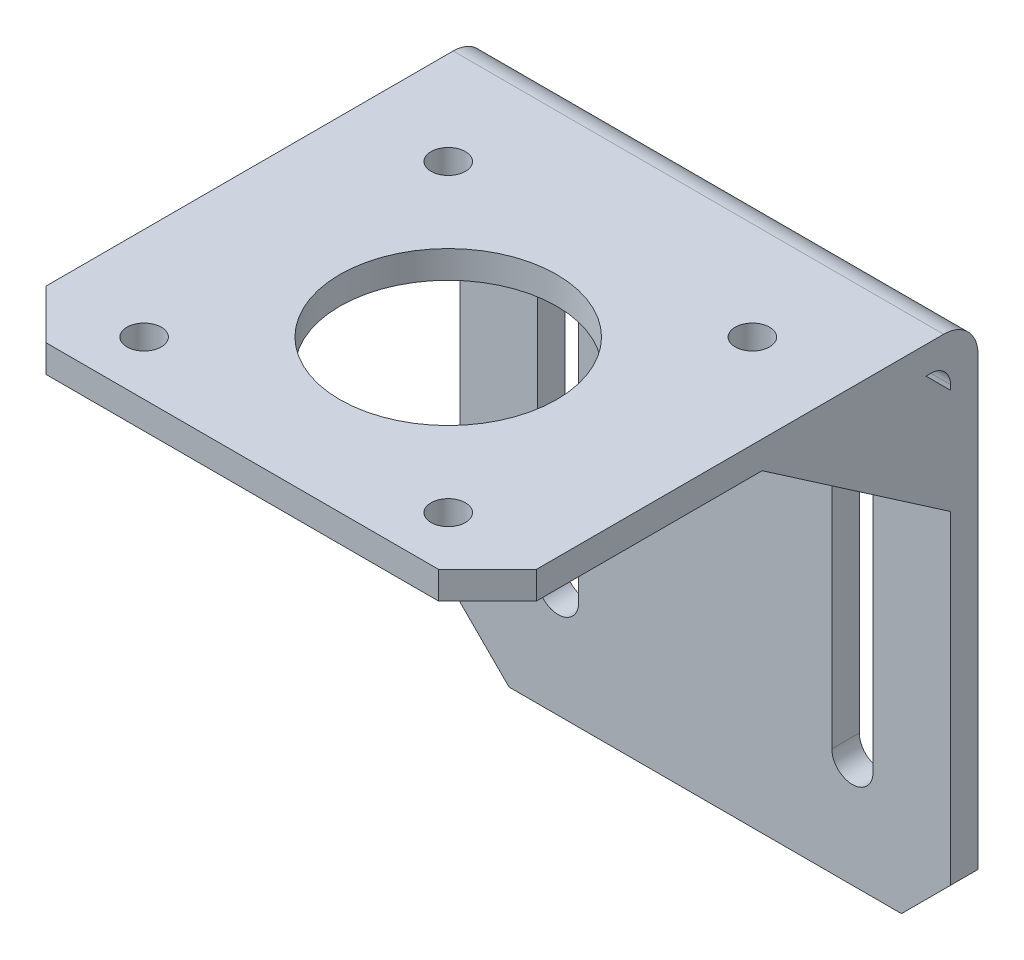
ISO-10303-21;
HEADER;
FILE_DESCRIPTION(('STEP AP214'),'2;1');
FILE_NAME('part.step','',(''),(''),'','','');
FILE_SCHEMA(('AUTOMOTIVE_DESIGN { 1 0 10303 214 1 1 1 1 }'));
ENDSEC;
DATA;
#1=APPLICATION_CONTEXT('core data for automotive mechanical design processes');
#2=APPLICATION_PROTOCOL_DEFINITION('international standard','automotive_design',2000,#1);
#3=PRODUCT_CONTEXT('',#1,'mechanical');
#4=PRODUCT('Part','Part','',(#3));
#5=PRODUCT_RELATED_PRODUCT_CATEGORY('part','',(#4));
#6=PRODUCT_DEFINITION_FORMATION('','',#4);
#7=PRODUCT_DEFINITION_CONTEXT('part definition',#1,'design');
#8=PRODUCT_DEFINITION('design','',#6,#7);
#9=PRODUCT_DEFINITION_SHAPE('','',#8);
#10=(LENGTH_UNIT() NAMED_UNIT(*) SI_UNIT(.MILLI.,.METRE.));
#11=(NAMED_UNIT(*) PLANE_ANGLE_UNIT() SI_UNIT($,.RADIAN.));
#12=(NAMED_UNIT(*) SI_UNIT($,.STERADIAN.) SOLID_ANGLE_UNIT());
#13=UNCERTAINTY_MEASURE_WITH_UNIT(LENGTH_MEASURE(1.E-05),#10,'distance_accuracy_value','');
#14=(GEOMETRIC_REPRESENTATION_CONTEXT(3) GLOBAL_UNCERTAINTY_ASSIGNED_CONTEXT((#13)) GLOBAL_UNIT_ASSIGNED_CONTEXT((#10,
#11,#12)) REPRESENTATION_CONTEXT('',''));
#15=CARTESIAN_POINT('',(0.,0.,0.));
#16=DIRECTION('',(0.,0.,1.));
#17=DIRECTION('',(1.,0.,0.));
#18=AXIS2_PLACEMENT_3D('',#15,#16,#17);
#19=CARTESIAN_POINT('',(-25.,-2.80000000000001,2.8));
#20=DIRECTION('',(0.,0.,1.));
#21=DIRECTION('',(0.,-1.,0.));
#22=AXIS2_PLACEMENT_3D('',#19,#20,#21);
#23=PLANE('',#22);
#24=CARTESIAN_POINT('',(15.,-43.,2.8));
#25=DIRECTION('',(0.,0.,1.));
#26=DIRECTION('',(0.,-1.,0.));
#27=AXIS2_PLACEMENT_3D('',#24,#25,#26);
#28=CIRCLE('',#27,2.1);
#29=CARTESIAN_POINT('',(12.9,-43.,2.8));
#30=VERTEX_POINT('',#29);
#31=CARTESIAN_POINT('',(17.1,-43.,2.8));
#32=VERTEX_POINT('',#31);
#33=EDGE_CURVE('E469',#30,#32,#28,.T.);
#34=ORIENTED_EDGE('',*,*,#33,.F.);
#35=DIRECTION('',(0.,-1.,0.));
#36=VECTOR('',#35,1.);
#37=CARTESIAN_POINT('',(12.9,-2.80000000000001,2.8));
#38=LINE('',#37,#36);
#39=CARTESIAN_POINT('',(12.9,-13.,2.8));
#40=VERTEX_POINT('',#39);
#41=EDGE_CURVE('E459',#40,#30,#38,.T.);
#42=ORIENTED_EDGE('',*,*,#41,.F.);
#43=CARTESIAN_POINT('',(15.,-13.,2.8));
#44=DIRECTION('',(0.,0.,1.));
#45=DIRECTION('',(0.,-1.,0.));
#46=AXIS2_PLACEMENT_3D('',#43,#44,#45);
#47=CIRCLE('',#46,2.1);
#48=CARTESIAN_POINT('',(17.1,-13.,2.8));
#49=VERTEX_POINT('',#48);
#50=EDGE_CURVE('E462',#49,#40,#47,.T.);
#51=ORIENTED_EDGE('',*,*,#50,.F.);
#52=DIRECTION('',(0.,1.,0.));
#53=VECTOR('',#52,1.);
#54=CARTESIAN_POINT('',(17.1,-2.80000000000002,2.8));
#55=LINE('',#54,#53);
#56=EDGE_CURVE('E466',#32,#49,#55,.T.);
#57=ORIENTED_EDGE('',*,*,#56,.F.);
#58=EDGE_LOOP('',(#34,#42,#51,#57));
#59=FACE_BOUND('',#58,.T.);
#60=CARTESIAN_POINT('',(-15.,-43.,2.8));
#61=DIRECTION('',(0.,0.,1.));
#62=DIRECTION('',(0.,-1.,0.));
#63=AXIS2_PLACEMENT_3D('',#60,#61,#62);
#64=CIRCLE('',#63,2.1);
#65=CARTESIAN_POINT('',(-17.1,-43.,2.8));
#66=VERTEX_POINT('',#65);
#67=CARTESIAN_POINT('',(-12.9,-43.,2.8));
#68=VERTEX_POINT('',#67);
#69=EDGE_CURVE('E456',#66,#68,#64,.T.);
#70=ORIENTED_EDGE('',*,*,#69,.F.);
#71=DIRECTION('',(0.,-1.,0.));
#72=VECTOR('',#71,1.);
#73=CARTESIAN_POINT('',(-17.1,-2.80000000000001,2.8));
#74=LINE('',#73,#72);
#75=CARTESIAN_POINT('',(-17.1,-13.,2.8));
#76=VERTEX_POINT('',#75);
#77=EDGE_CURVE('E417',#76,#66,#74,.T.);
#78=ORIENTED_EDGE('',*,*,#77,.F.);
#79=CARTESIAN_POINT('',(-15.,-13.,2.8));
#80=DIRECTION('',(0.,0.,1.));
#81=DIRECTION('',(0.,-1.,0.));
#82=AXIS2_PLACEMENT_3D('',#79,#80,#81);
#83=CIRCLE('',#82,2.1);
#84=CARTESIAN_POINT('',(-12.9,-13.,2.8));
#85=VERTEX_POINT('',#84);
#86=EDGE_CURVE('E449',#85,#76,#83,.T.);
#87=ORIENTED_EDGE('',*,*,#86,.F.);
#88=DIRECTION('',(0.,1.,0.));
#89=VECTOR('',#88,1.);
#90=CARTESIAN_POINT('',(-12.9,-2.80000000000001,2.8));
#91=LINE('',#90,#89);
#92=EDGE_CURVE('E453',#68,#85,#91,.T.);
#93=ORIENTED_EDGE('',*,*,#92,.F.);
#94=EDGE_LOOP('',(#70,#78,#87,#93));
#95=FACE_BOUND('',#94,.T.);
#96=DIRECTION('',(0.,-1.,0.));
#97=VECTOR('',#96,1.);
#98=CARTESIAN_POINT('',(25.,-2.80000000000001,2.8));
#99=LINE('',#98,#97);
#100=CARTESIAN_POINT('',(25.,-16.,2.8));
#101=VERTEX_POINT('',#100);
#102=CARTESIAN_POINT('',(25.,-49.,2.79999999999999));
#103=VERTEX_POINT('',#102);
#104=EDGE_CURVE('E389',#101,#103,#99,.T.);
#105=ORIENTED_EDGE('',*,*,#104,.F.);
#106=DIRECTION('',(1.,0.,0.));
#107=VECTOR('',#106,1.);
#108=CARTESIAN_POINT('',(22.5,-16.,2.8));
#109=LINE('',#108,#107);
#110=CARTESIAN_POINT('',(22.5,-16.,2.8));
#111=VERTEX_POINT('',#110);
#112=EDGE_CURVE('E55',#111,#101,#109,.T.);
#113=ORIENTED_EDGE('',*,*,#112,.F.);
#114=DIRECTION('',(0.,-1.,0.));
#115=VECTOR('',#114,1.);
#116=CARTESIAN_POINT('',(22.5,-16.,2.8));
#117=LINE('',#116,#115);
#118=CARTESIAN_POINT('',(22.5,-5.30000000000003,2.8));
#119=VERTEX_POINT('',#118);
#120=EDGE_CURVE('E228',#119,#111,#117,.T.);
#121=ORIENTED_EDGE('',*,*,#120,.F.);
#122=DIRECTION('',(1.,0.,0.));
#123=VECTOR('',#122,1.);
#124=CARTESIAN_POINT('',(22.5,-5.30000000000003,2.8));
#125=LINE('',#124,#123);
#126=CARTESIAN_POINT('',(25.,-5.30000000000003,2.8));
#127=VERTEX_POINT('',#126);
#128=EDGE_CURVE('E236',#119,#127,#125,.T.);
#129=ORIENTED_EDGE('',*,*,#128,.T.);
#130=CARTESIAN_POINT('',(25.,-4.80000000000001,2.8));
#131=VERTEX_POINT('',#130);
#132=EDGE_CURVE('E390',#131,#127,#99,.T.);
#133=ORIENTED_EDGE('',*,*,#132,.F.);
#134=DIRECTION('',(1.,0.,0.));
#135=VECTOR('',#134,1.);
#136=CARTESIAN_POINT('',(-25.,-4.80000000000001,2.8));
#137=LINE('',#136,#135);
#138=CARTESIAN_POINT('',(-25.,-4.80000000000001,2.8));
#139=VERTEX_POINT('',#138);
#140=EDGE_CURVE('E532',#131,#139,#137,.F.);
#141=ORIENTED_EDGE('',*,*,#140,.T.);
#142=DIRECTION('',(0.,-1.,0.));
#143=VECTOR('',#142,1.);
#144=CARTESIAN_POINT('',(-25.,-2.80000000000001,2.8));
#145=LINE('',#144,#143);
#146=CARTESIAN_POINT('',(-25.,-5.30000000000003,2.8));
#147=VERTEX_POINT('',#146);
#148=EDGE_CURVE('E405',#139,#147,#145,.T.);
#149=ORIENTED_EDGE('',*,*,#148,.T.);
#150=DIRECTION('',(-1.,0.,0.));
#151=VECTOR('',#150,1.);
#152=CARTESIAN_POINT('',(-22.5,-5.30000000000003,2.8));
#153=LINE('',#152,#151);
#154=CARTESIAN_POINT('',(-22.5,-5.30000000000003,2.8));
#155=VERTEX_POINT('',#154);
#156=EDGE_CURVE('E288',#155,#147,#153,.T.);
#157=ORIENTED_EDGE('',*,*,#156,.F.);
#158=DIRECTION('',(0.,-1.,0.));
#159=VECTOR('',#158,1.);
#160=CARTESIAN_POINT('',(-22.5,-16.,2.8));
#161=LINE('',#160,#159);
#162=CARTESIAN_POINT('',(-22.5,-16.,2.8));
#163=VERTEX_POINT('',#162);
#164=EDGE_CURVE('E266',#155,#163,#161,.T.);
#165=ORIENTED_EDGE('',*,*,#164,.T.);
#166=DIRECTION('',(-1.,0.,0.));
#167=VECTOR('',#166,1.);
#168=CARTESIAN_POINT('',(-22.5,-16.,2.8));
#169=LINE('',#168,#167);
#170=CARTESIAN_POINT('',(-25.,-16.,2.8));
#171=VERTEX_POINT('',#170);
#172=EDGE_CURVE('E281',#163,#171,#169,.T.);
#173=ORIENTED_EDGE('',*,*,#172,.T.);
#174=CARTESIAN_POINT('',(-25.,-49.,2.79999999999999));
#175=VERTEX_POINT('',#174);
#176=EDGE_CURVE('E404',#171,#175,#145,.T.);
#177=ORIENTED_EDGE('',*,*,#176,.T.);
#178=DIRECTION('',(0.707106781186546,-0.707106781186548,0.));
#179=VECTOR('',#178,1.);
#180=CARTESIAN_POINT('',(-48.1,-25.8999999999999,2.8));
#181=LINE('',#180,#179);
#182=CARTESIAN_POINT('',(-20.,-54.,2.79999999999999));
#183=VERTEX_POINT('',#182);
#184=EDGE_CURVE('E493',#175,#183,#181,.T.);
#185=ORIENTED_EDGE('',*,*,#184,.T.);
#186=DIRECTION('',(1.,0.,0.));
#187=VECTOR('',#186,1.);
#188=CARTESIAN_POINT('',(-25.,-54.,2.79999999999999));
#189=LINE('',#188,#187);
#190=CARTESIAN_POINT('',(20.,-54.,2.79999999999999));
#191=VERTEX_POINT('',#190);
#192=EDGE_CURVE('E418',#183,#191,#189,.T.);
#193=ORIENTED_EDGE('',*,*,#192,.T.);
#194=DIRECTION('',(-0.707106781186549,-0.707106781186547,0.));
#195=VECTOR('',#194,1.);
#196=CARTESIAN_POINT('',(23.0999999999999,-50.9000000000001,2.79999999999999));
#197=LINE('',#196,#195);
#198=EDGE_CURVE('E496',#191,#103,#197,.F.);
#199=ORIENTED_EDGE('',*,*,#198,.T.);
#200=EDGE_LOOP('',(#105,#113,#121,#129,#133,#141,#149,#157,#165,#173,#177,#185,#193,#199));
#201=FACE_BOUND('',#200,.T.);
#202=ADVANCED_FACE('F39',(#59,#95,#201),#23,.T.);
#203=CARTESIAN_POINT('',(-25.,-2.80000000000001,50.));
#204=DIRECTION('',(0.,-1.,0.));
#205=DIRECTION('',(0.,0.,-1.));
#206=AXIS2_PLACEMENT_3D('',#203,#204,#205);
#207=PLANE('',#206);
#208=CARTESIAN_POINT('',(-15.5,-2.8,44.5));
#209=DIRECTION('',(0.,-1.,0.));
#210=DIRECTION('',(0.,0.,-1.));
#211=AXIS2_PLACEMENT_3D('',#208,#209,#210);
#212=CIRCLE('',#211,1.75);
#213=CARTESIAN_POINT('',(-15.5,-2.8,42.75));
#214=VERTEX_POINT('',#213);
#215=EDGE_CURVE('E384',#214,#214,#212,.T.);
#216=ORIENTED_EDGE('',*,*,#215,.F.);
#217=EDGE_LOOP('',(#216));
#218=FACE_BOUND('',#217,.T.);
#219=CARTESIAN_POINT('',(15.5,-2.8,44.5));
#220=DIRECTION('',(0.,-1.,0.));
#221=DIRECTION('',(0.,0.,-1.));
#222=AXIS2_PLACEMENT_3D('',#219,#220,#221);
#223=CIRCLE('',#222,1.75);
#224=CARTESIAN_POINT('',(15.5,-2.8,42.75));
#225=VERTEX_POINT('',#224);
#226=EDGE_CURVE('E440',#225,#225,#223,.T.);
#227=ORIENTED_EDGE('',*,*,#226,.F.);
#228=EDGE_LOOP('',(#227));
#229=FACE_BOUND('',#228,.T.);
#230=CARTESIAN_POINT('',(15.5,-2.8,13.5));
#231=DIRECTION('',(0.,-1.,0.));
#232=DIRECTION('',(0.,0.,-1.));
#233=AXIS2_PLACEMENT_3D('',#230,#231,#232);
#234=CIRCLE('',#233,1.75);
#235=CARTESIAN_POINT('',(15.5,-2.8,11.75));
#236=VERTEX_POINT('',#235);
#237=EDGE_CURVE('E436',#236,#236,#234,.T.);
#238=ORIENTED_EDGE('',*,*,#237,.F.);
#239=EDGE_LOOP('',(#238));
#240=FACE_BOUND('',#239,.T.);
#241=CARTESIAN_POINT('',(-15.5,-2.8,13.5));
#242=DIRECTION('',(0.,-1.,0.));
#243=DIRECTION('',(0.,0.,-1.));
#244=AXIS2_PLACEMENT_3D('',#241,#242,#243);
#245=CIRCLE('',#244,1.75);
#246=CARTESIAN_POINT('',(-15.5,-2.8,11.75));
#247=VERTEX_POINT('',#246);
#248=EDGE_CURVE('E432',#247,#247,#245,.T.);
#249=ORIENTED_EDGE('',*,*,#248,.F.);
#250=EDGE_LOOP('',(#249));
#251=FACE_BOUND('',#250,.T.);
#252=CARTESIAN_POINT('',(0.,-2.8,29.));
#253=DIRECTION('',(0.,-1.,0.));
#254=DIRECTION('',(0.,0.,-1.));
#255=AXIS2_PLACEMENT_3D('',#252,#253,#254);
#256=CIRCLE('',#255,11.05);
#257=CARTESIAN_POINT('',(0.,-2.8,17.95));
#258=VERTEX_POINT('',#257);
#259=EDGE_CURVE('E379',#258,#258,#256,.T.);
#260=ORIENTED_EDGE('',*,*,#259,.F.);
#261=EDGE_LOOP('',(#260));
#262=FACE_BOUND('',#261,.T.);
#263=DIRECTION('',(0.,0.,-1.));
#264=VECTOR('',#263,1.);
#265=CARTESIAN_POINT('',(22.5,-2.80000000000001,5.3));
#266=LINE('',#265,#264);
#267=CARTESIAN_POINT('',(22.5,-2.8,22.));
#268=VERTEX_POINT('',#267);
#269=CARTESIAN_POINT('',(22.5,-2.80000000000001,5.3));
#270=VERTEX_POINT('',#269);
#271=EDGE_CURVE('E230',#268,#270,#266,.T.);
#272=ORIENTED_EDGE('',*,*,#271,.F.);
#273=DIRECTION('',(1.,0.,0.));
#274=VECTOR('',#273,1.);
#275=CARTESIAN_POINT('',(22.5,-2.8,22.));
#276=LINE('',#275,#274);
#277=CARTESIAN_POINT('',(25.,-2.8,22.));
#278=VERTEX_POINT('',#277);
#279=EDGE_CURVE('E260',#268,#278,#276,.T.);
#280=ORIENTED_EDGE('',*,*,#279,.T.);
#281=DIRECTION('',(0.,0.,-1.));
#282=VECTOR('',#281,1.);
#283=CARTESIAN_POINT('',(25.,-2.80000000000001,50.));
#284=LINE('',#283,#282);
#285=CARTESIAN_POINT('',(25.,-2.80000000000001,45.));
#286=VERTEX_POINT('',#285);
#287=EDGE_CURVE('E385',#286,#278,#284,.T.);
#288=ORIENTED_EDGE('',*,*,#287,.F.);
#289=DIRECTION('',(0.707106781186549,0.,-0.707106781186547));
#290=VECTOR('',#289,1.);
#291=CARTESIAN_POINT('',(-2.50000000000008,-2.80000000000001,72.5));
#292=LINE('',#291,#290);
#293=CARTESIAN_POINT('',(20.,-2.80000000000001,50.));
#294=VERTEX_POINT('',#293);
#295=EDGE_CURVE('E515',#286,#294,#292,.F.);
#296=ORIENTED_EDGE('',*,*,#295,.T.);
#297=DIRECTION('',(1.,0.,0.));
#298=VECTOR('',#297,1.);
#299=CARTESIAN_POINT('',(-25.,-2.80000000000001,50.));
#300=LINE('',#299,#298);
#301=CARTESIAN_POINT('',(-20.,-2.80000000000001,50.));
#302=VERTEX_POINT('',#301);
#303=EDGE_CURVE('E422',#302,#294,#300,.T.);
#304=ORIENTED_EDGE('',*,*,#303,.F.);
#305=DIRECTION('',(-0.707106781186547,0.,-0.707106781186549));
#306=VECTOR('',#305,1.);
#307=CARTESIAN_POINT('',(-22.5,-2.80000000000001,47.5));
#308=LINE('',#307,#306);
#309=CARTESIAN_POINT('',(-25.,-2.80000000000001,45.));
#310=VERTEX_POINT('',#309);
#311=EDGE_CURVE('E518',#302,#310,#308,.T.);
#312=ORIENTED_EDGE('',*,*,#311,.T.);
#313=DIRECTION('',(0.,0.,-1.));
#314=VECTOR('',#313,1.);
#315=CARTESIAN_POINT('',(-25.,-2.80000000000001,50.));
#316=LINE('',#315,#314);
#317=CARTESIAN_POINT('',(-25.,-2.8,22.));
#318=VERTEX_POINT('',#317);
#319=EDGE_CURVE('E401',#310,#318,#316,.T.);
#320=ORIENTED_EDGE('',*,*,#319,.T.);
#321=DIRECTION('',(-1.,0.,0.));
#322=VECTOR('',#321,1.);
#323=CARTESIAN_POINT('',(-22.5,-2.8,22.));
#324=LINE('',#323,#322);
#325=CARTESIAN_POINT('',(-22.5,-2.80000000000001,22.));
#326=VERTEX_POINT('',#325);
#327=EDGE_CURVE('E297',#326,#318,#324,.T.);
#328=ORIENTED_EDGE('',*,*,#327,.F.);
#329=DIRECTION('',(0.,0.,-1.));
#330=VECTOR('',#329,1.);
#331=CARTESIAN_POINT('',(-22.5,-2.80000000000001,5.3));
#332=LINE('',#331,#330);
#333=CARTESIAN_POINT('',(-22.5,-2.80000000000001,5.3));
#334=VERTEX_POINT('',#333);
#335=EDGE_CURVE('E274',#326,#334,#332,.T.);
#336=ORIENTED_EDGE('',*,*,#335,.T.);
#337=DIRECTION('',(-1.,0.,0.));
#338=VECTOR('',#337,1.);
#339=CARTESIAN_POINT('',(-22.5,-2.80000000000001,5.3));
#340=LINE('',#339,#338);
#341=CARTESIAN_POINT('',(-25.,-2.80000000000001,5.3));
#342=VERTEX_POINT('',#341);
#343=EDGE_CURVE('E293',#334,#342,#340,.T.);
#344=ORIENTED_EDGE('',*,*,#343,.T.);
#345=CARTESIAN_POINT('',(-25.,-2.80000000000001,4.8));
#346=VERTEX_POINT('',#345);
#347=EDGE_CURVE('E400',#342,#346,#316,.T.);
#348=ORIENTED_EDGE('',*,*,#347,.T.);
#349=DIRECTION('',(1.,0.,0.));
#350=VECTOR('',#349,1.);
#351=CARTESIAN_POINT('',(25.,-2.80000000000001,4.8));
#352=LINE('',#351,#350);
#353=CARTESIAN_POINT('',(25.,-2.80000000000001,4.8));
#354=VERTEX_POINT('',#353);
#355=EDGE_CURVE('E528',#346,#354,#352,.T.);
#356=ORIENTED_EDGE('',*,*,#355,.T.);
#357=CARTESIAN_POINT('',(25.,-2.80000000000001,5.3));
#358=VERTEX_POINT('',#357);
#359=EDGE_CURVE('E383',#358,#354,#284,.T.);
#360=ORIENTED_EDGE('',*,*,#359,.F.);
#361=DIRECTION('',(1.,0.,0.));
#362=VECTOR('',#361,1.);
#363=CARTESIAN_POINT('',(22.5,-2.80000000000001,5.3));
#364=LINE('',#363,#362);
#365=EDGE_CURVE('E241',#270,#358,#364,.T.);
#366=ORIENTED_EDGE('',*,*,#365,.F.);
#367=EDGE_LOOP('',(#272,#280,#288,#296,#304,#312,#320,#328,#336,#344,#348,#356,#360,#366));
#368=FACE_BOUND('',#367,.T.);
#369=ADVANCED_FACE('F592',(#218,#229,#240,#251,#262,#368),#207,.T.);
#370=CARTESIAN_POINT('',(-25.,0.,0.));
#371=DIRECTION('',(0.,1.,0.));
#372=DIRECTION('',(0.,0.,1.));
#373=AXIS2_PLACEMENT_3D('',#370,#371,#372);
#374=PLANE('',#373);
#375=CARTESIAN_POINT('',(-15.5,0.,44.5));
#376=DIRECTION('',(0.,1.,0.));
#377=DIRECTION('',(0.,0.,1.));
#378=AXIS2_PLACEMENT_3D('',#375,#376,#377);
#379=CIRCLE('',#378,1.75);
#380=CARTESIAN_POINT('',(-15.5,0.,46.25));
#381=VERTEX_POINT('',#380);
#382=EDGE_CURVE('E324',#381,#381,#379,.T.);
#383=ORIENTED_EDGE('',*,*,#382,.F.);
#384=EDGE_LOOP('',(#383));
#385=FACE_BOUND('',#384,.T.);
#386=CARTESIAN_POINT('',(15.5,0.,44.5));
#387=DIRECTION('',(0.,1.,0.));
#388=DIRECTION('',(0.,0.,1.));
#389=AXIS2_PLACEMENT_3D('',#386,#387,#388);
#390=CIRCLE('',#389,1.75);
#391=CARTESIAN_POINT('',(15.5,0.,46.25));
#392=VERTEX_POINT('',#391);
#393=EDGE_CURVE('E369',#392,#392,#390,.T.);
#394=ORIENTED_EDGE('',*,*,#393,.F.);
#395=EDGE_LOOP('',(#394));
#396=FACE_BOUND('',#395,.T.);
#397=CARTESIAN_POINT('',(15.5,0.,13.5));
#398=DIRECTION('',(0.,1.,0.));
#399=DIRECTION('',(0.,0.,1.));
#400=AXIS2_PLACEMENT_3D('',#397,#398,#399);
#401=CIRCLE('',#400,1.75);
#402=CARTESIAN_POINT('',(15.5,0.,15.25));
#403=VERTEX_POINT('',#402);
#404=EDGE_CURVE('E365',#403,#403,#401,.T.);
#405=ORIENTED_EDGE('',*,*,#404,.F.);
#406=EDGE_LOOP('',(#405));
#407=FACE_BOUND('',#406,.T.);
#408=CARTESIAN_POINT('',(-15.5,0.,13.5));
#409=DIRECTION('',(0.,1.,0.));
#410=DIRECTION('',(0.,0.,1.));
#411=AXIS2_PLACEMENT_3D('',#408,#409,#410);
#412=CIRCLE('',#411,1.75);
#413=CARTESIAN_POINT('',(-15.5,0.,15.25));
#414=VERTEX_POINT('',#413);
#415=EDGE_CURVE('E360',#414,#414,#412,.T.);
#416=ORIENTED_EDGE('',*,*,#415,.F.);
#417=EDGE_LOOP('',(#416));
#418=FACE_BOUND('',#417,.T.);
#419=CARTESIAN_POINT('',(0.,0.,29.));
#420=DIRECTION('',(0.,1.,0.));
#421=DIRECTION('',(0.,0.,1.));
#422=AXIS2_PLACEMENT_3D('',#419,#420,#421);
#423=CIRCLE('',#422,11.05);
#424=CARTESIAN_POINT('',(0.,0.,40.05));
#425=VERTEX_POINT('',#424);
#426=EDGE_CURVE('E364',#425,#425,#423,.T.);
#427=ORIENTED_EDGE('',*,*,#426,.F.);
#428=EDGE_LOOP('',(#427));
#429=FACE_BOUND('',#428,.T.);
#430=DIRECTION('',(0.,0.,1.));
#431=VECTOR('',#430,1.);
#432=CARTESIAN_POINT('',(25.,0.,0.));
#433=LINE('',#432,#431);
#434=CARTESIAN_POINT('',(25.,0.,3.5));
#435=VERTEX_POINT('',#434);
#436=CARTESIAN_POINT('',(25.,0.,45.));
#437=VERTEX_POINT('',#436);
#438=EDGE_CURVE('E380',#435,#437,#433,.T.);
#439=ORIENTED_EDGE('',*,*,#438,.F.);
#440=DIRECTION('',(1.,0.,0.));
#441=VECTOR('',#440,1.);
#442=CARTESIAN_POINT('',(-25.,0.,3.5));
#443=LINE('',#442,#441);
#444=CARTESIAN_POINT('',(-25.,0.,3.5));
#445=VERTEX_POINT('',#444);
#446=EDGE_CURVE('E48',#435,#445,#443,.F.);
#447=ORIENTED_EDGE('',*,*,#446,.T.);
#448=DIRECTION('',(0.,0.,1.));
#449=VECTOR('',#448,1.);
#450=CARTESIAN_POINT('',(-25.,0.,0.));
#451=LINE('',#450,#449);
#452=CARTESIAN_POINT('',(-25.,0.,45.));
#453=VERTEX_POINT('',#452);
#454=EDGE_CURVE('E397',#445,#453,#451,.T.);
#455=ORIENTED_EDGE('',*,*,#454,.T.);
#456=DIRECTION('',(0.707106781186547,0.,0.707106781186549));
#457=VECTOR('',#456,1.);
#458=CARTESIAN_POINT('',(-47.5,0.,22.4999999999999));
#459=LINE('',#458,#457);
#460=CARTESIAN_POINT('',(-20.,0.,50.));
#461=VERTEX_POINT('',#460);
#462=EDGE_CURVE('E525',#453,#461,#459,.T.);
#463=ORIENTED_EDGE('',*,*,#462,.T.);
#464=DIRECTION('',(1.,0.,0.));
#465=VECTOR('',#464,1.);
#466=CARTESIAN_POINT('',(-25.,0.,50.));
#467=LINE('',#466,#465);
#468=CARTESIAN_POINT('',(20.,0.,50.));
#469=VERTEX_POINT('',#468);
#470=EDGE_CURVE('E412',#461,#469,#467,.T.);
#471=ORIENTED_EDGE('',*,*,#470,.T.);
#472=DIRECTION('',(-0.707106781186549,0.,0.707106781186547));
#473=VECTOR('',#472,1.);
#474=CARTESIAN_POINT('',(22.4999999999999,0.,47.5000000000001));
#475=LINE('',#474,#473);
#476=EDGE_CURVE('E521',#469,#437,#475,.F.);
#477=ORIENTED_EDGE('',*,*,#476,.T.);
#478=EDGE_LOOP('',(#439,#447,#455,#463,#471,#477));
#479=FACE_BOUND('',#478,.T.);
#480=ADVANCED_FACE('F553',(#385,#396,#407,#418,#429,#479),#374,.T.);
#481=CARTESIAN_POINT('',(-25.,-54.,0.));
#482=DIRECTION('',(0.,0.,-1.));
#483=DIRECTION('',(-1.,0.,0.));
#484=AXIS2_PLACEMENT_3D('',#481,#482,#483);
#485=PLANE('',#484);
#486=CARTESIAN_POINT('',(15.,-43.,0.));
#487=DIRECTION('',(0.,0.,-1.));
#488=DIRECTION('',(-1.,0.,0.));
#489=AXIS2_PLACEMENT_3D('',#486,#487,#488);
#490=CIRCLE('',#489,2.1);
#491=CARTESIAN_POINT('',(17.1,-43.,0.));
#492=VERTEX_POINT('',#491);
#493=CARTESIAN_POINT('',(12.9,-43.,0.));
#494=VERTEX_POINT('',#493);
#495=EDGE_CURVE('E304',#492,#494,#490,.T.);
#496=ORIENTED_EDGE('',*,*,#495,.F.);
#497=DIRECTION('',(0.,-1.,0.));
#498=VECTOR('',#497,1.);
#499=CARTESIAN_POINT('',(17.1,-43.,0.));
#500=LINE('',#499,#498);
#501=CARTESIAN_POINT('',(17.1,-13.,0.));
#502=VERTEX_POINT('',#501);
#503=EDGE_CURVE('E316',#502,#492,#500,.T.);
#504=ORIENTED_EDGE('',*,*,#503,.F.);
#505=CARTESIAN_POINT('',(15.,-13.,0.));
#506=DIRECTION('',(0.,0.,-1.));
#507=DIRECTION('',(-1.,0.,0.));
#508=AXIS2_PLACEMENT_3D('',#505,#506,#507);
#509=CIRCLE('',#508,2.1);
#510=CARTESIAN_POINT('',(12.9,-13.,0.));
#511=VERTEX_POINT('',#510);
#512=EDGE_CURVE('E312',#511,#502,#509,.T.);
#513=ORIENTED_EDGE('',*,*,#512,.F.);
#514=DIRECTION('',(0.,1.,0.));
#515=VECTOR('',#514,1.);
#516=CARTESIAN_POINT('',(12.9,-43.,0.));
#517=LINE('',#516,#515);
#518=EDGE_CURVE('E307',#494,#511,#517,.T.);
#519=ORIENTED_EDGE('',*,*,#518,.F.);
#520=EDGE_LOOP('',(#496,#504,#513,#519));
#521=FACE_BOUND('',#520,.T.);
#522=CARTESIAN_POINT('',(-15.,-43.,0.));
#523=DIRECTION('',(0.,0.,-1.));
#524=DIRECTION('',(-1.,0.,0.));
#525=AXIS2_PLACEMENT_3D('',#522,#523,#524);
#526=CIRCLE('',#525,2.1);
#527=CARTESIAN_POINT('',(-12.9,-43.,0.));
#528=VERTEX_POINT('',#527);
#529=CARTESIAN_POINT('',(-17.1,-43.,0.));
#530=VERTEX_POINT('',#529);
#531=EDGE_CURVE('E292',#528,#530,#526,.T.);
#532=ORIENTED_EDGE('',*,*,#531,.F.);
#533=DIRECTION('',(0.,-1.,0.));
#534=VECTOR('',#533,1.);
#535=CARTESIAN_POINT('',(-12.9,-43.,0.));
#536=LINE('',#535,#534);
#537=CARTESIAN_POINT('',(-12.9,-13.,0.));
#538=VERTEX_POINT('',#537);
#539=EDGE_CURVE('E344',#538,#528,#536,.T.);
#540=ORIENTED_EDGE('',*,*,#539,.F.);
#541=CARTESIAN_POINT('',(-15.,-13.,0.));
#542=DIRECTION('',(0.,0.,-1.));
#543=DIRECTION('',(-1.,0.,0.));
#544=AXIS2_PLACEMENT_3D('',#541,#542,#543);
#545=CIRCLE('',#544,2.1);
#546=CARTESIAN_POINT('',(-17.1,-13.,0.));
#547=VERTEX_POINT('',#546);
#548=EDGE_CURVE('E340',#547,#538,#545,.T.);
#549=ORIENTED_EDGE('',*,*,#548,.F.);
#550=DIRECTION('',(0.,1.,0.));
#551=VECTOR('',#550,1.);
#552=CARTESIAN_POINT('',(-17.1,-43.,0.));
#553=LINE('',#552,#551);
#554=EDGE_CURVE('E336',#530,#547,#553,.T.);
#555=ORIENTED_EDGE('',*,*,#554,.F.);
#556=EDGE_LOOP('',(#532,#540,#549,#555));
#557=FACE_BOUND('',#556,.T.);
#558=DIRECTION('',(0.,1.,0.));
#559=VECTOR('',#558,1.);
#560=CARTESIAN_POINT('',(-25.,-54.,0.));
#561=LINE('',#560,#559);
#562=CARTESIAN_POINT('',(-25.,-49.,0.));
#563=VERTEX_POINT('',#562);
#564=CARTESIAN_POINT('',(-25.,-3.5,0.));
#565=VERTEX_POINT('',#564);
#566=EDGE_CURVE('E408',#563,#565,#561,.T.);
#567=ORIENTED_EDGE('',*,*,#566,.T.);
#568=DIRECTION('',(1.,0.,0.));
#569=VECTOR('',#568,1.);
#570=CARTESIAN_POINT('',(-25.,-3.5,0.));
#571=LINE('',#570,#569);
#572=CARTESIAN_POINT('',(25.,-3.5,0.));
#573=VERTEX_POINT('',#572);
#574=EDGE_CURVE('E542',#565,#573,#571,.T.);
#575=ORIENTED_EDGE('',*,*,#574,.T.);
#576=DIRECTION('',(0.,1.,0.));
#577=VECTOR('',#576,1.);
#578=CARTESIAN_POINT('',(25.,-54.,0.));
#579=LINE('',#578,#577);
#580=CARTESIAN_POINT('',(25.,-49.,0.));
#581=VERTEX_POINT('',#580);
#582=EDGE_CURVE('E393',#581,#573,#579,.T.);
#583=ORIENTED_EDGE('',*,*,#582,.F.);
#584=DIRECTION('',(0.707106781186549,0.707106781186547,0.));
#585=VECTOR('',#584,1.);
#586=CARTESIAN_POINT('',(-2.50000000000007,-76.5,0.));
#587=LINE('',#586,#585);
#588=CARTESIAN_POINT('',(20.,-54.,0.));
#589=VERTEX_POINT('',#588);
#590=EDGE_CURVE('E483',#581,#589,#587,.F.);
#591=ORIENTED_EDGE('',*,*,#590,.T.);
#592=DIRECTION('',(1.,0.,0.));
#593=VECTOR('',#592,1.);
#594=CARTESIAN_POINT('',(-25.,-54.,0.));
#595=LINE('',#594,#593);
#596=CARTESIAN_POINT('',(-20.,-54.,0.));
#597=VERTEX_POINT('',#596);
#598=EDGE_CURVE('E413',#597,#589,#595,.T.);
#599=ORIENTED_EDGE('',*,*,#598,.F.);
#600=DIRECTION('',(-0.707106781186547,0.707106781186549,0.));
#601=VECTOR('',#600,1.);
#602=CARTESIAN_POINT('',(-22.5,-51.5,0.));
#603=LINE('',#602,#601);
#604=EDGE_CURVE('E480',#597,#563,#603,.T.);
#605=ORIENTED_EDGE('',*,*,#604,.T.);
#606=EDGE_LOOP('',(#567,#575,#583,#591,#599,#605));
#607=FACE_BOUND('',#606,.T.);
#608=ADVANCED_FACE('F566',(#521,#557,#607),#485,.T.);
#609=CARTESIAN_POINT('',(-25.,-54.,2.79999999999999));
#610=DIRECTION('',(0.,-1.,0.));
#611=DIRECTION('',(0.,0.,-1.));
#612=AXIS2_PLACEMENT_3D('',#609,#610,#611);
#613=PLANE('',#612);
#614=ORIENTED_EDGE('',*,*,#598,.T.);
#615=DIRECTION('',(0.,0.,1.));
#616=VECTOR('',#615,1.);
#617=CARTESIAN_POINT('',(20.,-54.,2.79999999999999));
#618=LINE('',#617,#616);
#619=EDGE_CURVE('E490',#589,#191,#618,.T.);
#620=ORIENTED_EDGE('',*,*,#619,.T.);
#621=ORIENTED_EDGE('',*,*,#192,.F.);
#622=DIRECTION('',(0.,0.,-1.));
#623=VECTOR('',#622,1.);
#624=CARTESIAN_POINT('',(-20.,-54.,0.));
#625=LINE('',#624,#623);
#626=EDGE_CURVE('E486',#183,#597,#625,.T.);
#627=ORIENTED_EDGE('',*,*,#626,.T.);
#628=EDGE_LOOP('',(#614,#620,#621,#627));
#629=FACE_BOUND('',#628,.T.);
#630=ADVANCED_FACE('F576',(#629),#613,.T.);
#631=CARTESIAN_POINT('',(-25.,0.,50.));
#632=DIRECTION('',(0.,0.,1.));
#633=DIRECTION('',(1.,0.,0.));
#634=AXIS2_PLACEMENT_3D('',#631,#632,#633);
#635=PLANE('',#634);
#636=ORIENTED_EDGE('',*,*,#470,.F.);
#637=DIRECTION('',(0.,-1.,0.));
#638=VECTOR('',#637,1.);
#639=CARTESIAN_POINT('',(-20.,-2.80000000000001,50.));
#640=LINE('',#639,#638);
#641=EDGE_CURVE('E511',#461,#302,#640,.T.);
#642=ORIENTED_EDGE('',*,*,#641,.T.);
#643=ORIENTED_EDGE('',*,*,#303,.T.);
#644=DIRECTION('',(0.,1.,0.));
#645=VECTOR('',#644,1.);
#646=CARTESIAN_POINT('',(20.,0.,50.));
#647=LINE('',#646,#645);
#648=EDGE_CURVE('E508',#294,#469,#647,.T.);
#649=ORIENTED_EDGE('',*,*,#648,.T.);
#650=EDGE_LOOP('',(#636,#642,#643,#649));
#651=FACE_BOUND('',#650,.T.);
#652=ADVANCED_FACE('F621',(#651),#635,.T.);
#653=CARTESIAN_POINT('',(-25.,0.,0.));
#654=DIRECTION('',(1.,0.,0.));
#655=DIRECTION('',(0.,0.,-1.));
#656=AXIS2_PLACEMENT_3D('',#653,#654,#655);
#657=PLANE('',#656);
#658=ORIENTED_EDGE('',*,*,#176,.F.);
#659=DIRECTION('',(0.,0.566528822887065,0.824041924199368));
#660=VECTOR('',#659,1.);
#661=CARTESIAN_POINT('',(-25.,-2.8,22.));
#662=LINE('',#661,#660);
#663=EDGE_CURVE('E259',#171,#318,#662,.T.);
#664=ORIENTED_EDGE('',*,*,#663,.T.);
#665=ORIENTED_EDGE('',*,*,#319,.F.);
#666=DIRECTION('',(0.,1.,0.));
#667=VECTOR('',#666,1.);
#668=CARTESIAN_POINT('',(-25.,0.,45.));
#669=LINE('',#668,#667);
#670=EDGE_CURVE('E500',#310,#453,#669,.T.);
#671=ORIENTED_EDGE('',*,*,#670,.T.);
#672=ORIENTED_EDGE('',*,*,#454,.F.);
#673=CARTESIAN_POINT('',(-25.,-3.5,3.5));
#674=DIRECTION('',(1.,0.,0.));
#675=DIRECTION('',(0.,0.,-1.));
#676=AXIS2_PLACEMENT_3D('',#673,#674,#675);
#677=CIRCLE('',#676,3.5);
#678=EDGE_CURVE('E11',#445,#565,#677,.F.);
#679=ORIENTED_EDGE('',*,*,#678,.T.);
#680=ORIENTED_EDGE('',*,*,#566,.F.);
#681=DIRECTION('',(0.,0.,1.));
#682=VECTOR('',#681,1.);
#683=CARTESIAN_POINT('',(-25.,-49.,2.79999999999999));
#684=LINE('',#683,#682);
#685=EDGE_CURVE('E504',#563,#175,#684,.T.);
#686=ORIENTED_EDGE('',*,*,#685,.T.);
#687=EDGE_LOOP('',(#658,#664,#665,#671,#672,#679,#680,#686));
#688=FACE_BOUND('',#687,.T.);
#689=DIRECTION('',(0.,-0.707106781186551,-0.707106781186544));
#690=VECTOR('',#689,1.);
#691=CARTESIAN_POINT('',(-25.,-5.30000000000003,2.8));
#692=LINE('',#691,#690);
#693=EDGE_CURVE('E270',#342,#147,#692,.T.);
#694=ORIENTED_EDGE('',*,*,#693,.T.);
#695=ORIENTED_EDGE('',*,*,#148,.F.);
#696=CARTESIAN_POINT('',(-25.,-4.80000000000001,4.8));
#697=DIRECTION('',(1.,0.,0.));
#698=DIRECTION('',(0.,0.,-1.));
#699=AXIS2_PLACEMENT_3D('',#696,#697,#698);
#700=CIRCLE('',#699,2.);
#701=EDGE_CURVE('E538',#139,#346,#700,.T.);
#702=ORIENTED_EDGE('',*,*,#701,.T.);
#703=ORIENTED_EDGE('',*,*,#347,.F.);
#704=EDGE_LOOP('',(#694,#695,#702,#703));
#705=FACE_BOUND('',#704,.T.);
#706=ADVANCED_FACE('F557',(#688,#705),#657,.F.);
#707=CARTESIAN_POINT('',(25.,0.,0.));
#708=DIRECTION('',(1.,0.,0.));
#709=DIRECTION('',(0.,0.,-1.));
#710=AXIS2_PLACEMENT_3D('',#707,#708,#709);
#711=PLANE('',#710);
#712=DIRECTION('',(0.,0.566528822887065,0.824041924199368));
#713=VECTOR('',#712,1.);
#714=CARTESIAN_POINT('',(25.,-2.8,22.));
#715=LINE('',#714,#713);
#716=EDGE_CURVE('E246',#101,#278,#715,.T.);
#717=ORIENTED_EDGE('',*,*,#716,.F.);
#718=ORIENTED_EDGE('',*,*,#104,.T.);
#719=DIRECTION('',(0.,0.,-1.));
#720=VECTOR('',#719,1.);
#721=CARTESIAN_POINT('',(25.,-49.,0.));
#722=LINE('',#721,#720);
#723=EDGE_CURVE('E476',#103,#581,#722,.T.);
#724=ORIENTED_EDGE('',*,*,#723,.T.);
#725=ORIENTED_EDGE('',*,*,#582,.T.);
#726=CARTESIAN_POINT('',(25.,-3.5,3.5));
#727=DIRECTION('',(1.,0.,0.));
#728=DIRECTION('',(0.,0.,-1.));
#729=AXIS2_PLACEMENT_3D('',#726,#727,#728);
#730=CIRCLE('',#729,3.5);
#731=EDGE_CURVE('E546',#573,#435,#730,.T.);
#732=ORIENTED_EDGE('',*,*,#731,.T.);
#733=ORIENTED_EDGE('',*,*,#438,.T.);
#734=DIRECTION('',(0.,-1.,0.));
#735=VECTOR('',#734,1.);
#736=CARTESIAN_POINT('',(25.,0.,45.));
#737=LINE('',#736,#735);
#738=EDGE_CURVE('E472',#437,#286,#737,.T.);
#739=ORIENTED_EDGE('',*,*,#738,.T.);
#740=ORIENTED_EDGE('',*,*,#287,.T.);
#741=EDGE_LOOP('',(#717,#718,#724,#725,#732,#733,#739,#740));
#742=FACE_BOUND('',#741,.T.);
#743=ORIENTED_EDGE('',*,*,#132,.T.);
#744=DIRECTION('',(0.,-0.707106781186551,-0.707106781186544));
#745=VECTOR('',#744,1.);
#746=CARTESIAN_POINT('',(25.,-5.30000000000003,2.8));
#747=LINE('',#746,#745);
#748=EDGE_CURVE('E63',#358,#127,#747,.T.);
#749=ORIENTED_EDGE('',*,*,#748,.F.);
#750=ORIENTED_EDGE('',*,*,#359,.T.);
#751=CARTESIAN_POINT('',(25.,-4.80000000000001,4.8));
#752=DIRECTION('',(1.,0.,0.));
#753=DIRECTION('',(0.,0.,-1.));
#754=AXIS2_PLACEMENT_3D('',#751,#752,#753);
#755=CIRCLE('',#754,2.);
#756=EDGE_CURVE('E535',#354,#131,#755,.F.);
#757=ORIENTED_EDGE('',*,*,#756,.T.);
#758=EDGE_LOOP('',(#743,#749,#750,#757));
#759=FACE_BOUND('',#758,.T.);
#760=ADVANCED_FACE('F568',(#742,#759),#711,.T.);
#761=CARTESIAN_POINT('',(0.,-54.,29.));
#762=DIRECTION('',(0.,1.,0.));
#763=DIRECTION('',(0.,0.,1.));
#764=AXIS2_PLACEMENT_3D('',#761,#762,#763);
#765=CYLINDRICAL_SURFACE('',#764,11.05);
#766=ORIENTED_EDGE('',*,*,#259,.T.);
#767=EDGE_LOOP('',(#766));
#768=FACE_BOUND('',#767,.T.);
#769=ORIENTED_EDGE('',*,*,#426,.T.);
#770=EDGE_LOOP('',(#769));
#771=FACE_BOUND('',#770,.T.);
#772=ADVANCED_FACE('F692',(#768,#771),#765,.F.);
#773=CARTESIAN_POINT('',(-15.5,-54.,13.5));
#774=DIRECTION('',(0.,1.,0.));
#775=DIRECTION('',(0.,0.,1.));
#776=AXIS2_PLACEMENT_3D('',#773,#774,#775);
#777=CYLINDRICAL_SURFACE('',#776,1.75);
#778=ORIENTED_EDGE('',*,*,#248,.T.);
#779=EDGE_LOOP('',(#778));
#780=FACE_BOUND('',#779,.T.);
#781=ORIENTED_EDGE('',*,*,#415,.T.);
#782=EDGE_LOOP('',(#781));
#783=FACE_BOUND('',#782,.T.);
#784=ADVANCED_FACE('F688',(#780,#783),#777,.F.);
#785=CARTESIAN_POINT('',(15.5,-54.,13.5));
#786=DIRECTION('',(0.,1.,0.));
#787=DIRECTION('',(0.,0.,1.));
#788=AXIS2_PLACEMENT_3D('',#785,#786,#787);
#789=CYLINDRICAL_SURFACE('',#788,1.75);
#790=ORIENTED_EDGE('',*,*,#237,.T.);
#791=EDGE_LOOP('',(#790));
#792=FACE_BOUND('',#791,.T.);
#793=ORIENTED_EDGE('',*,*,#404,.T.);
#794=EDGE_LOOP('',(#793));
#795=FACE_BOUND('',#794,.T.);
#796=ADVANCED_FACE('F691',(#792,#795),#789,.F.);
#797=CARTESIAN_POINT('',(15.5,-54.,44.5));
#798=DIRECTION('',(0.,1.,0.));
#799=DIRECTION('',(0.,0.,1.));
#800=AXIS2_PLACEMENT_3D('',#797,#798,#799);
#801=CYLINDRICAL_SURFACE('',#800,1.75);
#802=ORIENTED_EDGE('',*,*,#226,.T.);
#803=EDGE_LOOP('',(#802));
#804=FACE_BOUND('',#803,.T.);
#805=ORIENTED_EDGE('',*,*,#393,.T.);
#806=EDGE_LOOP('',(#805));
#807=FACE_BOUND('',#806,.T.);
#808=ADVANCED_FACE('F696',(#804,#807),#801,.F.);
#809=CARTESIAN_POINT('',(-15.5,-54.,44.5));
#810=DIRECTION('',(0.,1.,0.));
#811=DIRECTION('',(0.,0.,1.));
#812=AXIS2_PLACEMENT_3D('',#809,#810,#811);
#813=CYLINDRICAL_SURFACE('',#812,1.75);
#814=ORIENTED_EDGE('',*,*,#215,.T.);
#815=EDGE_LOOP('',(#814));
#816=FACE_BOUND('',#815,.T.);
#817=ORIENTED_EDGE('',*,*,#382,.T.);
#818=EDGE_LOOP('',(#817));
#819=FACE_BOUND('',#818,.T.);
#820=ADVANCED_FACE('F686',(#816,#819),#813,.F.);
#821=CARTESIAN_POINT('',(-15.,-43.,50.));
#822=DIRECTION('',(0.,0.,-1.));
#823=DIRECTION('',(-1.,0.,0.));
#824=AXIS2_PLACEMENT_3D('',#821,#822,#823);
#825=CYLINDRICAL_SURFACE('',#824,2.1);
#826=ORIENTED_EDGE('',*,*,#69,.T.);
#827=DIRECTION('',(0.,0.,-1.));
#828=VECTOR('',#827,1.);
#829=CARTESIAN_POINT('',(-12.9,-43.,50.));
#830=LINE('',#829,#828);
#831=EDGE_CURVE('E308',#68,#528,#830,.T.);
#832=ORIENTED_EDGE('',*,*,#831,.T.);
#833=ORIENTED_EDGE('',*,*,#531,.T.);
#834=DIRECTION('',(0.,0.,-1.));
#835=VECTOR('',#834,1.);
#836=CARTESIAN_POINT('',(-17.1,-43.,50.));
#837=LINE('',#836,#835);
#838=EDGE_CURVE('E348',#66,#530,#837,.T.);
#839=ORIENTED_EDGE('',*,*,#838,.F.);
#840=EDGE_LOOP('',(#826,#832,#833,#839));
#841=FACE_BOUND('',#840,.T.);
#842=ADVANCED_FACE('F676',(#841),#825,.F.);
#843=CARTESIAN_POINT('',(-12.9,-43.,50.));
#844=DIRECTION('',(1.,0.,0.));
#845=DIRECTION('',(0.,1.,0.));
#846=AXIS2_PLACEMENT_3D('',#843,#844,#845);
#847=PLANE('',#846);
#848=ORIENTED_EDGE('',*,*,#92,.T.);
#849=DIRECTION('',(0.,0.,-1.));
#850=VECTOR('',#849,1.);
#851=CARTESIAN_POINT('',(-12.9,-13.,50.));
#852=LINE('',#851,#850);
#853=EDGE_CURVE('E351',#85,#538,#852,.T.);
#854=ORIENTED_EDGE('',*,*,#853,.T.);
#855=ORIENTED_EDGE('',*,*,#539,.T.);
#856=ORIENTED_EDGE('',*,*,#831,.F.);
#857=EDGE_LOOP('',(#848,#854,#855,#856));
#858=FACE_BOUND('',#857,.T.);
#859=ADVANCED_FACE('F672',(#858),#847,.F.);
#860=CARTESIAN_POINT('',(-15.,-13.,50.));
#861=DIRECTION('',(0.,0.,-1.));
#862=DIRECTION('',(-1.,0.,0.));
#863=AXIS2_PLACEMENT_3D('',#860,#861,#862);
#864=CYLINDRICAL_SURFACE('',#863,2.1);
#865=ORIENTED_EDGE('',*,*,#86,.T.);
#866=DIRECTION('',(0.,0.,-1.));
#867=VECTOR('',#866,1.);
#868=CARTESIAN_POINT('',(-17.1,-13.,50.));
#869=LINE('',#868,#867);
#870=EDGE_CURVE('E354',#76,#547,#869,.T.);
#871=ORIENTED_EDGE('',*,*,#870,.T.);
#872=ORIENTED_EDGE('',*,*,#548,.T.);
#873=ORIENTED_EDGE('',*,*,#853,.F.);
#874=EDGE_LOOP('',(#865,#871,#872,#873));
#875=FACE_BOUND('',#874,.T.);
#876=ADVANCED_FACE('F675',(#875),#864,.F.);
#877=CARTESIAN_POINT('',(-17.1,-43.,50.));
#878=DIRECTION('',(-1.,0.,0.));
#879=DIRECTION('',(0.,-1.,0.));
#880=AXIS2_PLACEMENT_3D('',#877,#878,#879);
#881=PLANE('',#880);
#882=ORIENTED_EDGE('',*,*,#77,.T.);
#883=ORIENTED_EDGE('',*,*,#838,.T.);
#884=ORIENTED_EDGE('',*,*,#554,.T.);
#885=ORIENTED_EDGE('',*,*,#870,.F.);
#886=EDGE_LOOP('',(#882,#883,#884,#885));
#887=FACE_BOUND('',#886,.T.);
#888=ADVANCED_FACE('F670',(#887),#881,.F.);
#889=CARTESIAN_POINT('',(15.,-43.,50.));
#890=DIRECTION('',(0.,0.,-1.));
#891=DIRECTION('',(-1.,0.,0.));
#892=AXIS2_PLACEMENT_3D('',#889,#890,#891);
#893=CYLINDRICAL_SURFACE('',#892,2.1);
#894=ORIENTED_EDGE('',*,*,#33,.T.);
#895=DIRECTION('',(0.,0.,-1.));
#896=VECTOR('',#895,1.);
#897=CARTESIAN_POINT('',(17.1,-43.,50.));
#898=LINE('',#897,#896);
#899=EDGE_CURVE('E321',#32,#492,#898,.T.);
#900=ORIENTED_EDGE('',*,*,#899,.T.);
#901=ORIENTED_EDGE('',*,*,#495,.T.);
#902=DIRECTION('',(0.,0.,-1.));
#903=VECTOR('',#902,1.);
#904=CARTESIAN_POINT('',(12.9,-43.,50.));
#905=LINE('',#904,#903);
#906=EDGE_CURVE('E320',#30,#494,#905,.T.);
#907=ORIENTED_EDGE('',*,*,#906,.F.);
#908=EDGE_LOOP('',(#894,#900,#901,#907));
#909=FACE_BOUND('',#908,.T.);
#910=ADVANCED_FACE('F667',(#909),#893,.F.);
#911=CARTESIAN_POINT('',(17.1,-43.,50.));
#912=DIRECTION('',(1.,0.,0.));
#913=DIRECTION('',(0.,1.,0.));
#914=AXIS2_PLACEMENT_3D('',#911,#912,#913);
#915=PLANE('',#914);
#916=ORIENTED_EDGE('',*,*,#56,.T.);
#917=DIRECTION('',(0.,0.,-1.));
#918=VECTOR('',#917,1.);
#919=CARTESIAN_POINT('',(17.1,-13.,50.));
#920=LINE('',#919,#918);
#921=EDGE_CURVE('E325',#49,#502,#920,.T.);
#922=ORIENTED_EDGE('',*,*,#921,.T.);
#923=ORIENTED_EDGE('',*,*,#503,.T.);
#924=ORIENTED_EDGE('',*,*,#899,.F.);
#925=EDGE_LOOP('',(#916,#922,#923,#924));
#926=FACE_BOUND('',#925,.T.);
#927=ADVANCED_FACE('F662',(#926),#915,.F.);
#928=CARTESIAN_POINT('',(15.,-13.,50.));
#929=DIRECTION('',(0.,0.,-1.));
#930=DIRECTION('',(-1.,0.,0.));
#931=AXIS2_PLACEMENT_3D('',#928,#929,#930);
#932=CYLINDRICAL_SURFACE('',#931,2.1);
#933=ORIENTED_EDGE('',*,*,#50,.T.);
#934=DIRECTION('',(0.,0.,-1.));
#935=VECTOR('',#934,1.);
#936=CARTESIAN_POINT('',(12.9,-13.,50.));
#937=LINE('',#936,#935);
#938=EDGE_CURVE('E328',#40,#511,#937,.T.);
#939=ORIENTED_EDGE('',*,*,#938,.T.);
#940=ORIENTED_EDGE('',*,*,#512,.T.);
#941=ORIENTED_EDGE('',*,*,#921,.F.);
#942=EDGE_LOOP('',(#933,#939,#940,#941));
#943=FACE_BOUND('',#942,.T.);
#944=ADVANCED_FACE('F656',(#943),#932,.F.);
#945=CARTESIAN_POINT('',(12.9,-43.,50.));
#946=DIRECTION('',(-1.,0.,0.));
#947=DIRECTION('',(0.,-1.,0.));
#948=AXIS2_PLACEMENT_3D('',#945,#946,#947);
#949=PLANE('',#948);
#950=ORIENTED_EDGE('',*,*,#41,.T.);
#951=ORIENTED_EDGE('',*,*,#906,.T.);
#952=ORIENTED_EDGE('',*,*,#518,.T.);
#953=ORIENTED_EDGE('',*,*,#938,.F.);
#954=EDGE_LOOP('',(#950,#951,#952,#953));
#955=FACE_BOUND('',#954,.T.);
#956=ADVANCED_FACE('F652',(#955),#949,.F.);
#957=CARTESIAN_POINT('',(25.,-49.,0.));
#958=DIRECTION('',(-0.707106781186547,0.707106781186549,0.));
#959=DIRECTION('',(0.,0.,-1.));
#960=AXIS2_PLACEMENT_3D('',#957,#958,#959);
#961=PLANE('',#960);
#962=ORIENTED_EDGE('',*,*,#198,.F.);
#963=ORIENTED_EDGE('',*,*,#619,.F.);
#964=ORIENTED_EDGE('',*,*,#590,.F.);
#965=ORIENTED_EDGE('',*,*,#723,.F.);
#966=EDGE_LOOP('',(#962,#963,#964,#965));
#967=FACE_BOUND('',#966,.T.);
#968=ADVANCED_FACE('F572',(#967),#961,.F.);
#969=CARTESIAN_POINT('',(-20.,-54.,2.79999999999999));
#970=DIRECTION('',(-0.707106781186548,-0.707106781186546,0.));
#971=DIRECTION('',(0.,0.,1.));
#972=AXIS2_PLACEMENT_3D('',#969,#970,#971);
#973=PLANE('',#972);
#974=ORIENTED_EDGE('',*,*,#184,.F.);
#975=ORIENTED_EDGE('',*,*,#685,.F.);
#976=ORIENTED_EDGE('',*,*,#604,.F.);
#977=ORIENTED_EDGE('',*,*,#626,.F.);
#978=EDGE_LOOP('',(#974,#975,#976,#977));
#979=FACE_BOUND('',#978,.T.);
#980=ADVANCED_FACE('F581',(#979),#973,.T.);
#981=CARTESIAN_POINT('',(-20.,0.,50.));
#982=DIRECTION('',(-0.707106781186548,0.,0.707106781186546));
#983=DIRECTION('',(0.,1.,0.));
#984=AXIS2_PLACEMENT_3D('',#981,#982,#983);
#985=PLANE('',#984);
#986=ORIENTED_EDGE('',*,*,#462,.F.);
#987=ORIENTED_EDGE('',*,*,#670,.F.);
#988=ORIENTED_EDGE('',*,*,#311,.F.);
#989=ORIENTED_EDGE('',*,*,#641,.F.);
#990=EDGE_LOOP('',(#986,#987,#988,#989));
#991=FACE_BOUND('',#990,.T.);
#992=ADVANCED_FACE('F624',(#991),#985,.T.);
#993=CARTESIAN_POINT('',(25.,0.,45.));
#994=DIRECTION('',(-0.707106781186546,0.,-0.707106781186548));
#995=DIRECTION('',(0.,-1.,0.));
#996=AXIS2_PLACEMENT_3D('',#993,#994,#995);
#997=PLANE('',#996);
#998=ORIENTED_EDGE('',*,*,#476,.F.);
#999=ORIENTED_EDGE('',*,*,#648,.F.);
#1000=ORIENTED_EDGE('',*,*,#295,.F.);
#1001=ORIENTED_EDGE('',*,*,#738,.F.);
#1002=EDGE_LOOP('',(#998,#999,#1000,#1001));
#1003=FACE_BOUND('',#1002,.T.);
#1004=ADVANCED_FACE('F616',(#1003),#997,.F.);
#1005=CARTESIAN_POINT('',(-25.,-4.80000000000001,4.8));
#1006=DIRECTION('',(-1.,0.,0.));
#1007=DIRECTION('',(0.,0.,1.));
#1008=AXIS2_PLACEMENT_3D('',#1005,#1006,#1007);
#1009=CYLINDRICAL_SURFACE('',#1008,2.);
#1010=ORIENTED_EDGE('',*,*,#701,.F.);
#1011=ORIENTED_EDGE('',*,*,#140,.F.);
#1012=ORIENTED_EDGE('',*,*,#756,.F.);
#1013=ORIENTED_EDGE('',*,*,#355,.F.);
#1014=EDGE_LOOP('',(#1010,#1011,#1012,#1013));
#1015=FACE_BOUND('',#1014,.T.);
#1016=ADVANCED_FACE('F608',(#1015),#1009,.F.);
#1017=CARTESIAN_POINT('',(-25.,-3.5,3.5));
#1018=DIRECTION('',(1.,0.,0.));
#1019=DIRECTION('',(0.,0.,-1.));
#1020=AXIS2_PLACEMENT_3D('',#1017,#1018,#1019);
#1021=CYLINDRICAL_SURFACE('',#1020,3.5);
#1022=ORIENTED_EDGE('',*,*,#678,.F.);
#1023=ORIENTED_EDGE('',*,*,#446,.F.);
#1024=ORIENTED_EDGE('',*,*,#731,.F.);
#1025=ORIENTED_EDGE('',*,*,#574,.F.);
#1026=EDGE_LOOP('',(#1022,#1023,#1024,#1025));
#1027=FACE_BOUND('',#1026,.T.);
#1028=ADVANCED_FACE('F41',(#1027),#1021,.T.);
#1029=CARTESIAN_POINT('',(-22.5,-5.30000000000003,2.8));
#1030=DIRECTION('',(0.,0.707106781186544,-0.707106781186551));
#1031=DIRECTION('',(0.,0.707106781186551,0.707106781186544));
#1032=AXIS2_PLACEMENT_3D('',#1029,#1030,#1031);
#1033=PLANE('',#1032);
#1034=ORIENTED_EDGE('',*,*,#693,.F.);
#1035=ORIENTED_EDGE('',*,*,#343,.F.);
#1036=DIRECTION('',(0.,-0.707106781186551,-0.707106781186544));
#1037=VECTOR('',#1036,1.);
#1038=CARTESIAN_POINT('',(-22.5,-5.30000000000003,2.8));
#1039=LINE('',#1038,#1037);
#1040=EDGE_CURVE('E277',#334,#155,#1039,.T.);
#1041=ORIENTED_EDGE('',*,*,#1040,.T.);
#1042=ORIENTED_EDGE('',*,*,#156,.T.);
#1043=EDGE_LOOP('',(#1034,#1035,#1041,#1042));
#1044=FACE_BOUND('',#1043,.T.);
#1045=ADVANCED_FACE('F599',(#1044),#1033,.T.);
#1046=CARTESIAN_POINT('',(-22.5,-2.8,22.));
#1047=DIRECTION('',(0.,-0.824041924199368,0.566528822887065));
#1048=DIRECTION('',(0.,-0.566528822887065,-0.824041924199368));
#1049=AXIS2_PLACEMENT_3D('',#1046,#1047,#1048);
#1050=PLANE('',#1049);
#1051=ORIENTED_EDGE('',*,*,#663,.F.);
#1052=ORIENTED_EDGE('',*,*,#172,.F.);
#1053=DIRECTION('',(0.,0.566528822887065,0.824041924199368));
#1054=VECTOR('',#1053,1.);
#1055=CARTESIAN_POINT('',(-22.5,-2.8,22.));
#1056=LINE('',#1055,#1054);
#1057=EDGE_CURVE('E269',#163,#326,#1056,.T.);
#1058=ORIENTED_EDGE('',*,*,#1057,.T.);
#1059=ORIENTED_EDGE('',*,*,#327,.T.);
#1060=EDGE_LOOP('',(#1051,#1052,#1058,#1059));
#1061=FACE_BOUND('',#1060,.T.);
#1062=ADVANCED_FACE('F589',(#1061),#1050,.T.);
#1063=CARTESIAN_POINT('',(-22.5,0.,0.));
#1064=DIRECTION('',(1.,0.,0.));
#1065=DIRECTION('',(0.,0.,-1.));
#1066=AXIS2_PLACEMENT_3D('',#1063,#1064,#1065);
#1067=PLANE('',#1066);
#1068=ORIENTED_EDGE('',*,*,#164,.F.);
#1069=ORIENTED_EDGE('',*,*,#1040,.F.);
#1070=ORIENTED_EDGE('',*,*,#335,.F.);
#1071=ORIENTED_EDGE('',*,*,#1057,.F.);
#1072=EDGE_LOOP('',(#1068,#1069,#1070,#1071));
#1073=FACE_BOUND('',#1072,.T.);
#1074=ADVANCED_FACE('F596',(#1073),#1067,.T.);
#1075=CARTESIAN_POINT('',(22.5,-2.8,22.));
#1076=DIRECTION('',(0.,0.824041924199368,-0.566528822887065));
#1077=DIRECTION('',(0.,0.566528822887065,0.824041924199368));
#1078=AXIS2_PLACEMENT_3D('',#1075,#1076,#1077);
#1079=PLANE('',#1078);
#1080=ORIENTED_EDGE('',*,*,#716,.T.);
#1081=ORIENTED_EDGE('',*,*,#279,.F.);
#1082=DIRECTION('',(0.,0.566528822887065,0.824041924199368));
#1083=VECTOR('',#1082,1.);
#1084=CARTESIAN_POINT('',(22.5,-2.8,22.));
#1085=LINE('',#1084,#1083);
#1086=EDGE_CURVE('E242',#111,#268,#1085,.T.);
#1087=ORIENTED_EDGE('',*,*,#1086,.F.);
#1088=ORIENTED_EDGE('',*,*,#112,.T.);
#1089=EDGE_LOOP('',(#1080,#1081,#1087,#1088));
#1090=FACE_BOUND('',#1089,.T.);
#1091=ADVANCED_FACE('F748',(#1090),#1079,.F.);
#1092=CARTESIAN_POINT('',(22.5,-5.30000000000003,2.8));
#1093=DIRECTION('',(0.,-0.707106781186544,0.707106781186551));
#1094=DIRECTION('',(0.,-0.707106781186551,-0.707106781186544));
#1095=AXIS2_PLACEMENT_3D('',#1092,#1093,#1094);
#1096=PLANE('',#1095);
#1097=ORIENTED_EDGE('',*,*,#748,.T.);
#1098=ORIENTED_EDGE('',*,*,#128,.F.);
#1099=DIRECTION('',(0.,-0.707106781186551,-0.707106781186544));
#1100=VECTOR('',#1099,1.);
#1101=CARTESIAN_POINT('',(22.5,-5.30000000000003,2.8));
#1102=LINE('',#1101,#1100);
#1103=EDGE_CURVE('E224',#270,#119,#1102,.T.);
#1104=ORIENTED_EDGE('',*,*,#1103,.F.);
#1105=ORIENTED_EDGE('',*,*,#365,.T.);
#1106=EDGE_LOOP('',(#1097,#1098,#1104,#1105));
#1107=FACE_BOUND('',#1106,.T.);
#1108=ADVANCED_FACE('F237',(#1107),#1096,.F.);
#1109=CARTESIAN_POINT('',(22.5,0.,0.));
#1110=DIRECTION('',(-1.,0.,0.));
#1111=DIRECTION('',(0.,0.,-1.));
#1112=AXIS2_PLACEMENT_3D('',#1109,#1110,#1111);
#1113=PLANE('',#1112);
#1114=ORIENTED_EDGE('',*,*,#120,.T.);
#1115=ORIENTED_EDGE('',*,*,#1086,.T.);
#1116=ORIENTED_EDGE('',*,*,#271,.T.);
#1117=ORIENTED_EDGE('',*,*,#1103,.T.);
#1118=EDGE_LOOP('',(#1114,#1115,#1116,#1117));
#1119=FACE_BOUND('',#1118,.T.);
#1120=ADVANCED_FACE('F226',(#1119),#1113,.T.);
#1121=CLOSED_SHELL('',(#202,#369,#480,#608,#630,#652,#706,#760,#772,#784,#796,#808,#820,#842,
#859,#876,#888,#910,#927,#944,#956,#968,#980,#992,#1004,#1016,#1028,#1045,#1062,#1074,#1091,
#1108,#1120));
#1122=MANIFOLD_SOLID_BREP('B2',#1121);
#1123=ADVANCED_BREP_SHAPE_REPRESENTATION('',(#18,#1122),#14);
#1124=SHAPE_DEFINITION_REPRESENTATION(#9,#1123);
ENDSEC;
END-ISO-10303-21;
